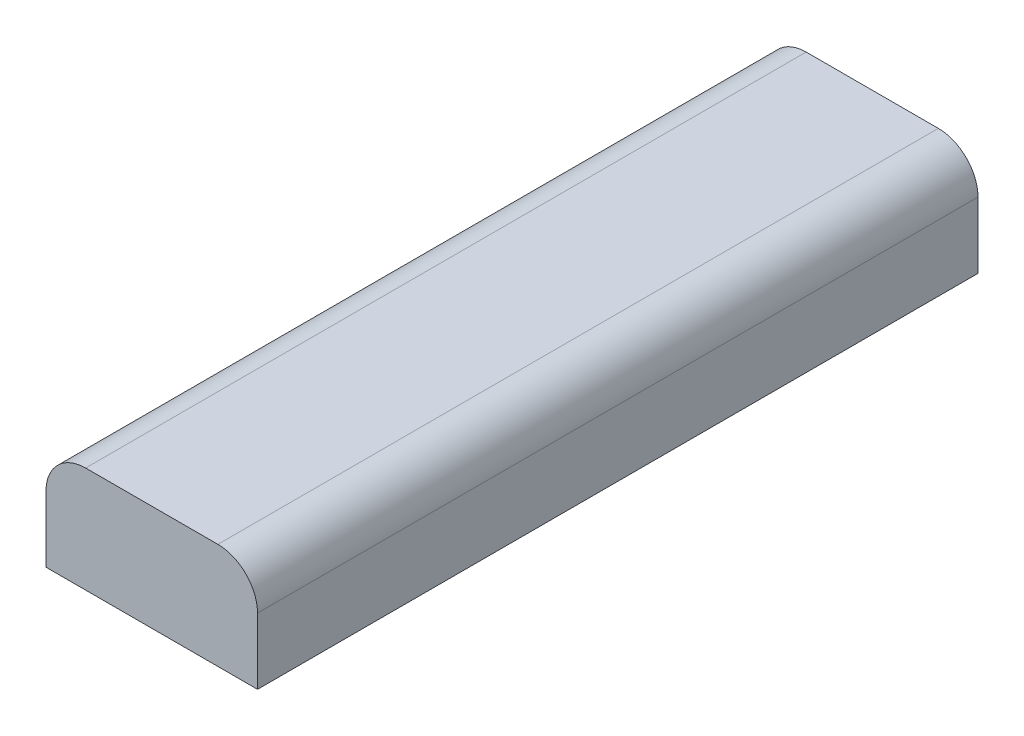
ISO-10303-21;
HEADER;
FILE_DESCRIPTION(('STEP AP214'),'2;1');
FILE_NAME('part.step','',(''),(''),'','','');
FILE_SCHEMA(('AUTOMOTIVE_DESIGN { 1 0 10303 214 1 1 1 1 }'));
ENDSEC;
DATA;
#1=APPLICATION_CONTEXT('core data for automotive mechanical design processes');
#2=APPLICATION_PROTOCOL_DEFINITION('international standard','automotive_design',2000,#1);
#3=PRODUCT_CONTEXT('',#1,'mechanical');
#4=PRODUCT('Part','Part','',(#3));
#5=PRODUCT_RELATED_PRODUCT_CATEGORY('part','',(#4));
#6=PRODUCT_DEFINITION_FORMATION('','',#4);
#7=PRODUCT_DEFINITION_CONTEXT('part definition',#1,'design');
#8=PRODUCT_DEFINITION('design','',#6,#7);
#9=PRODUCT_DEFINITION_SHAPE('','',#8);
#10=(LENGTH_UNIT() NAMED_UNIT(*) SI_UNIT(.MILLI.,.METRE.));
#11=(NAMED_UNIT(*) PLANE_ANGLE_UNIT() SI_UNIT($,.RADIAN.));
#12=(NAMED_UNIT(*) SI_UNIT($,.STERADIAN.) SOLID_ANGLE_UNIT());
#13=UNCERTAINTY_MEASURE_WITH_UNIT(LENGTH_MEASURE(1.E-05),#10,'distance_accuracy_value','');
#14=(GEOMETRIC_REPRESENTATION_CONTEXT(3) GLOBAL_UNCERTAINTY_ASSIGNED_CONTEXT((#13)) GLOBAL_UNIT_ASSIGNED_CONTEXT((#10,
#11,#12)) REPRESENTATION_CONTEXT('',''));
#15=CARTESIAN_POINT('',(0.,0.,0.));
#16=DIRECTION('',(0.,0.,1.));
#17=DIRECTION('',(1.,0.,0.));
#18=AXIS2_PLACEMENT_3D('',#15,#16,#17);
#19=CARTESIAN_POINT('',(0.,0.,109.));
#20=DIRECTION('',(1.,0.,0.));
#21=DIRECTION('',(0.,0.,-1.));
#22=AXIS2_PLACEMENT_3D('',#19,#20,#21);
#23=PLANE('',#22);
#24=DIRECTION('',(0.,-1.,0.));
#25=VECTOR('',#24,1.);
#26=CARTESIAN_POINT('',(0.,0.,109.));
#27=LINE('',#26,#25);
#28=CARTESIAN_POINT('',(0.,10.,109.));
#29=VERTEX_POINT('',#28);
#30=CARTESIAN_POINT('',(0.,0.,109.));
#31=VERTEX_POINT('',#30);
#32=EDGE_CURVE('E89',#29,#31,#27,.T.);
#33=ORIENTED_EDGE('',*,*,#32,.F.);
#34=DIRECTION('',(0.,0.,-1.));
#35=VECTOR('',#34,1.);
#36=CARTESIAN_POINT('',(0.,10.,109.));
#37=LINE('',#36,#35);
#38=CARTESIAN_POINT('',(0.,10.,0.));
#39=VERTEX_POINT('',#38);
#40=EDGE_CURVE('E112',#29,#39,#37,.T.);
#41=ORIENTED_EDGE('',*,*,#40,.T.);
#42=DIRECTION('',(0.,-1.,0.));
#43=VECTOR('',#42,1.);
#44=CARTESIAN_POINT('',(0.,0.,0.));
#45=LINE('',#44,#43);
#46=CARTESIAN_POINT('',(0.,0.,0.));
#47=VERTEX_POINT('',#46);
#48=EDGE_CURVE('E110',#39,#47,#45,.T.);
#49=ORIENTED_EDGE('',*,*,#48,.T.);
#50=DIRECTION('',(0.,0.,-1.));
#51=VECTOR('',#50,1.);
#52=CARTESIAN_POINT('',(0.,0.,109.));
#53=LINE('',#52,#51);
#54=EDGE_CURVE('E104',#31,#47,#53,.T.);
#55=ORIENTED_EDGE('',*,*,#54,.F.);
#56=EDGE_LOOP('',(#33,#41,#49,#55));
#57=FACE_BOUND('',#56,.T.);
#58=ADVANCED_FACE('F35',(#57),#23,.F.);
#59=CARTESIAN_POINT('',(0.,0.,109.));
#60=DIRECTION('',(0.,1.,0.));
#61=DIRECTION('',(0.,0.,1.));
#62=AXIS2_PLACEMENT_3D('',#59,#60,#61);
#63=PLANE('',#62);
#64=DIRECTION('',(1.,0.,0.));
#65=VECTOR('',#64,1.);
#66=CARTESIAN_POINT('',(0.,0.,0.));
#67=LINE('',#66,#65);
#68=CARTESIAN_POINT('',(32.,0.,0.));
#69=VERTEX_POINT('',#68);
#70=EDGE_CURVE('E139',#47,#69,#67,.T.);
#71=ORIENTED_EDGE('',*,*,#70,.T.);
#72=DIRECTION('',(0.,0.,-1.));
#73=VECTOR('',#72,1.);
#74=CARTESIAN_POINT('',(32.,0.,109.));
#75=LINE('',#74,#73);
#76=CARTESIAN_POINT('',(32.,0.,109.));
#77=VERTEX_POINT('',#76);
#78=EDGE_CURVE('E106',#77,#69,#75,.T.);
#79=ORIENTED_EDGE('',*,*,#78,.F.);
#80=DIRECTION('',(1.,0.,0.));
#81=VECTOR('',#80,1.);
#82=CARTESIAN_POINT('',(0.,0.,109.));
#83=LINE('',#82,#81);
#84=EDGE_CURVE('E92',#31,#77,#83,.T.);
#85=ORIENTED_EDGE('',*,*,#84,.F.);
#86=ORIENTED_EDGE('',*,*,#54,.T.);
#87=EDGE_LOOP('',(#71,#79,#85,#86));
#88=FACE_BOUND('',#87,.T.);
#89=ADVANCED_FACE('F103',(#88),#63,.F.);
#90=CARTESIAN_POINT('',(32.,0.,109.));
#91=DIRECTION('',(-1.,0.,0.));
#92=DIRECTION('',(0.,0.,1.));
#93=AXIS2_PLACEMENT_3D('',#90,#91,#92);
#94=PLANE('',#93);
#95=DIRECTION('',(0.,1.,0.));
#96=VECTOR('',#95,1.);
#97=CARTESIAN_POINT('',(32.,0.,0.));
#98=LINE('',#97,#96);
#99=CARTESIAN_POINT('',(32.,10.,0.));
#100=VERTEX_POINT('',#99);
#101=EDGE_CURVE('E137',#69,#100,#98,.T.);
#102=ORIENTED_EDGE('',*,*,#101,.T.);
#103=DIRECTION('',(0.,0.,-1.));
#104=VECTOR('',#103,1.);
#105=CARTESIAN_POINT('',(32.,10.,109.));
#106=LINE('',#105,#104);
#107=CARTESIAN_POINT('',(32.,10.,109.));
#108=VERTEX_POINT('',#107);
#109=EDGE_CURVE('E11',#100,#108,#106,.F.);
#110=ORIENTED_EDGE('',*,*,#109,.T.);
#111=DIRECTION('',(0.,1.,0.));
#112=VECTOR('',#111,1.);
#113=CARTESIAN_POINT('',(32.,0.,109.));
#114=LINE('',#113,#112);
#115=EDGE_CURVE('E107',#77,#108,#114,.T.);
#116=ORIENTED_EDGE('',*,*,#115,.F.);
#117=ORIENTED_EDGE('',*,*,#78,.T.);
#118=EDGE_LOOP('',(#102,#110,#116,#117));
#119=FACE_BOUND('',#118,.T.);
#120=ADVANCED_FACE('F138',(#119),#94,.F.);
#121=CARTESIAN_POINT('',(0.,16.,109.));
#122=DIRECTION('',(0.,-1.,0.));
#123=DIRECTION('',(0.,0.,-1.));
#124=AXIS2_PLACEMENT_3D('',#121,#122,#123);
#125=PLANE('',#124);
#126=DIRECTION('',(-1.,0.,0.));
#127=VECTOR('',#126,1.);
#128=CARTESIAN_POINT('',(0.,16.,0.));
#129=LINE('',#128,#127);
#130=CARTESIAN_POINT('',(26.,16.,0.));
#131=VERTEX_POINT('',#130);
#132=CARTESIAN_POINT('',(6.,16.,0.));
#133=VERTEX_POINT('',#132);
#134=EDGE_CURVE('E99',#131,#133,#129,.T.);
#135=ORIENTED_EDGE('',*,*,#134,.T.);
#136=DIRECTION('',(0.,0.,-1.));
#137=VECTOR('',#136,1.);
#138=CARTESIAN_POINT('',(6.,16.,109.));
#139=LINE('',#138,#137);
#140=CARTESIAN_POINT('',(6.,16.,109.));
#141=VERTEX_POINT('',#140);
#142=EDGE_CURVE('E56',#133,#141,#139,.F.);
#143=ORIENTED_EDGE('',*,*,#142,.T.);
#144=DIRECTION('',(-1.,0.,0.));
#145=VECTOR('',#144,1.);
#146=CARTESIAN_POINT('',(0.,16.,109.));
#147=LINE('',#146,#145);
#148=CARTESIAN_POINT('',(26.,16.,109.));
#149=VERTEX_POINT('',#148);
#150=EDGE_CURVE('E116',#149,#141,#147,.T.);
#151=ORIENTED_EDGE('',*,*,#150,.F.);
#152=DIRECTION('',(0.,0.,-1.));
#153=VECTOR('',#152,1.);
#154=CARTESIAN_POINT('',(26.,16.,109.));
#155=LINE('',#154,#153);
#156=EDGE_CURVE('E123',#149,#131,#155,.T.);
#157=ORIENTED_EDGE('',*,*,#156,.T.);
#158=EDGE_LOOP('',(#135,#143,#151,#157));
#159=FACE_BOUND('',#158,.T.);
#160=ADVANCED_FACE('F131',(#159),#125,.F.);
#161=CARTESIAN_POINT('',(0.,0.,109.));
#162=DIRECTION('',(0.,0.,-1.));
#163=DIRECTION('',(-1.,0.,0.));
#164=AXIS2_PLACEMENT_3D('',#161,#162,#163);
#165=PLANE('',#164);
#166=ORIENTED_EDGE('',*,*,#150,.T.);
#167=CARTESIAN_POINT('',(6.,10.,109.));
#168=DIRECTION('',(0.,0.,-1.));
#169=DIRECTION('',(-1.,0.,0.));
#170=AXIS2_PLACEMENT_3D('',#167,#168,#169);
#171=CIRCLE('',#170,6.);
#172=EDGE_CURVE('E43',#141,#29,#171,.F.);
#173=ORIENTED_EDGE('',*,*,#172,.T.);
#174=ORIENTED_EDGE('',*,*,#32,.T.);
#175=ORIENTED_EDGE('',*,*,#84,.T.);
#176=ORIENTED_EDGE('',*,*,#115,.T.);
#177=CARTESIAN_POINT('',(26.,10.,109.));
#178=DIRECTION('',(0.,0.,-1.));
#179=DIRECTION('',(-1.,0.,0.));
#180=AXIS2_PLACEMENT_3D('',#177,#178,#179);
#181=CIRCLE('',#180,6.);
#182=EDGE_CURVE('E127',#108,#149,#181,.F.);
#183=ORIENTED_EDGE('',*,*,#182,.T.);
#184=EDGE_LOOP('',(#166,#173,#174,#175,#176,#183));
#185=FACE_BOUND('',#184,.T.);
#186=ADVANCED_FACE('F91',(#185),#165,.F.);
#187=CARTESIAN_POINT('',(0.,0.,0.));
#188=DIRECTION('',(0.,0.,-1.));
#189=DIRECTION('',(-1.,0.,0.));
#190=AXIS2_PLACEMENT_3D('',#187,#188,#189);
#191=PLANE('',#190);
#192=ORIENTED_EDGE('',*,*,#48,.F.);
#193=CARTESIAN_POINT('',(6.,10.,0.));
#194=DIRECTION('',(0.,0.,-1.));
#195=DIRECTION('',(-1.,0.,0.));
#196=AXIS2_PLACEMENT_3D('',#193,#194,#195);
#197=CIRCLE('',#196,6.);
#198=EDGE_CURVE('E121',#39,#133,#197,.T.);
#199=ORIENTED_EDGE('',*,*,#198,.T.);
#200=ORIENTED_EDGE('',*,*,#134,.F.);
#201=CARTESIAN_POINT('',(26.,10.,0.));
#202=DIRECTION('',(0.,0.,-1.));
#203=DIRECTION('',(-1.,0.,0.));
#204=AXIS2_PLACEMENT_3D('',#201,#202,#203);
#205=CIRCLE('',#204,6.);
#206=EDGE_CURVE('E114',#131,#100,#205,.T.);
#207=ORIENTED_EDGE('',*,*,#206,.T.);
#208=ORIENTED_EDGE('',*,*,#101,.F.);
#209=ORIENTED_EDGE('',*,*,#70,.F.);
#210=EDGE_LOOP('',(#192,#199,#200,#207,#208,#209));
#211=FACE_BOUND('',#210,.T.);
#212=ADVANCED_FACE('F136',(#211),#191,.T.);
#213=CARTESIAN_POINT('',(6.,10.,109.));
#214=DIRECTION('',(0.,0.,-1.));
#215=DIRECTION('',(-1.,0.,0.));
#216=AXIS2_PLACEMENT_3D('',#213,#214,#215);
#217=CYLINDRICAL_SURFACE('',#216,6.);
#218=ORIENTED_EDGE('',*,*,#172,.F.);
#219=ORIENTED_EDGE('',*,*,#142,.F.);
#220=ORIENTED_EDGE('',*,*,#198,.F.);
#221=ORIENTED_EDGE('',*,*,#40,.F.);
#222=EDGE_LOOP('',(#218,#219,#220,#221));
#223=FACE_BOUND('',#222,.T.);
#224=ADVANCED_FACE('F145',(#223),#217,.T.);
#225=CARTESIAN_POINT('',(26.,10.,109.));
#226=DIRECTION('',(0.,0.,-1.));
#227=DIRECTION('',(-1.,0.,0.));
#228=AXIS2_PLACEMENT_3D('',#225,#226,#227);
#229=CYLINDRICAL_SURFACE('',#228,6.);
#230=ORIENTED_EDGE('',*,*,#182,.F.);
#231=ORIENTED_EDGE('',*,*,#109,.F.);
#232=ORIENTED_EDGE('',*,*,#206,.F.);
#233=ORIENTED_EDGE('',*,*,#156,.F.);
#234=EDGE_LOOP('',(#230,#231,#232,#233));
#235=FACE_BOUND('',#234,.T.);
#236=ADVANCED_FACE('F37',(#235),#229,.T.);
#237=CLOSED_SHELL('',(#58,#89,#120,#160,#186,#212,#224,#236));
#238=MANIFOLD_SOLID_BREP('B2',#237);
#239=ADVANCED_BREP_SHAPE_REPRESENTATION('',(#18,#238),#14);
#240=SHAPE_DEFINITION_REPRESENTATION(#9,#239);
ENDSEC;
END-ISO-10303-21;
